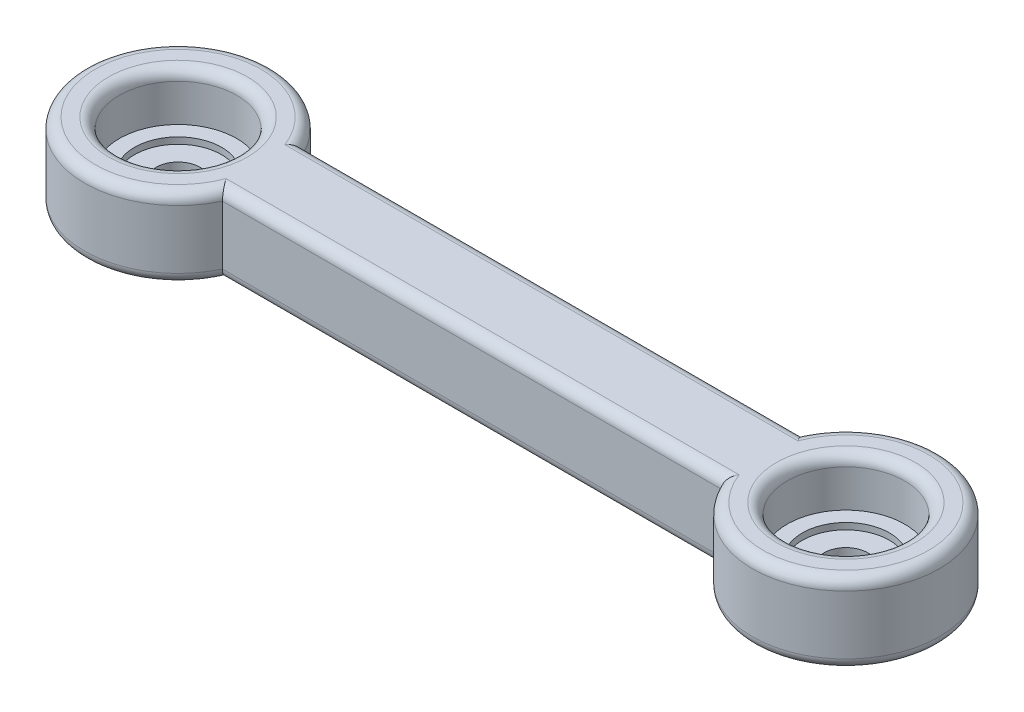
ISO-10303-21;
HEADER;
FILE_DESCRIPTION(('STEP AP214'),'2;1');
FILE_NAME('part.step','',(''),(''),'','','');
FILE_SCHEMA(('AUTOMOTIVE_DESIGN { 1 0 10303 214 1 1 1 1 }'));
ENDSEC;
DATA;
#1=APPLICATION_CONTEXT('core data for automotive mechanical design processes');
#2=APPLICATION_PROTOCOL_DEFINITION('international standard','automotive_design',2000,#1);
#3=PRODUCT_CONTEXT('',#1,'mechanical');
#4=PRODUCT('Part','Part','',(#3));
#5=PRODUCT_RELATED_PRODUCT_CATEGORY('part','',(#4));
#6=PRODUCT_DEFINITION_FORMATION('','',#4);
#7=PRODUCT_DEFINITION_CONTEXT('part definition',#1,'design');
#8=PRODUCT_DEFINITION('design','',#6,#7);
#9=PRODUCT_DEFINITION_SHAPE('','',#8);
#10=(LENGTH_UNIT() NAMED_UNIT(*) SI_UNIT(.MILLI.,.METRE.));
#11=(NAMED_UNIT(*) PLANE_ANGLE_UNIT() SI_UNIT($,.RADIAN.));
#12=(NAMED_UNIT(*) SI_UNIT($,.STERADIAN.) SOLID_ANGLE_UNIT());
#13=UNCERTAINTY_MEASURE_WITH_UNIT(LENGTH_MEASURE(1.E-05),#10,'distance_accuracy_value','');
#14=(GEOMETRIC_REPRESENTATION_CONTEXT(3) GLOBAL_UNCERTAINTY_ASSIGNED_CONTEXT((#13)) GLOBAL_UNIT_ASSIGNED_CONTEXT((#10,
#11,#12)) REPRESENTATION_CONTEXT('',''));
#15=CARTESIAN_POINT('',(0.,0.,0.));
#16=DIRECTION('',(0.,0.,1.));
#17=DIRECTION('',(1.,0.,0.));
#18=AXIS2_PLACEMENT_3D('',#15,#16,#17);
#19=CARTESIAN_POINT('',(62.4999999999998,15.,0.));
#20=DIRECTION('',(0.,1.,0.));
#21=DIRECTION('',(0.,0.,1.));
#22=AXIS2_PLACEMENT_3D('',#19,#20,#21);
#23=PLANE('',#22);
#24=CARTESIAN_POINT('',(62.4999999999998,15.,0.));
#25=DIRECTION('',(0.,1.,0.));
#26=DIRECTION('',(0.,0.,1.));
#27=AXIS2_PLACEMENT_3D('',#24,#25,#26);
#28=CIRCLE('',#27,13.);
#29=CARTESIAN_POINT('',(62.4999999999998,15.,13.));
#30=VERTEX_POINT('',#29);
#31=EDGE_CURVE('E54',#30,#30,#28,.F.);
#32=ORIENTED_EDGE('',*,*,#31,.T.);
#33=EDGE_LOOP('',(#32));
#34=FACE_BOUND('',#33,.T.);
#35=CARTESIAN_POINT('',(-62.5000000000002,15.,0.));
#36=DIRECTION('',(0.,1.,0.));
#37=DIRECTION('',(0.,0.,1.));
#38=AXIS2_PLACEMENT_3D('',#35,#36,#37);
#39=CIRCLE('',#38,15.5);
#40=CARTESIAN_POINT('',(-48.0086232538107,15.,-5.49999999999998));
#41=VERTEX_POINT('',#40);
#42=CARTESIAN_POINT('',(-48.0086232538107,15.,5.50000000000002));
#43=VERTEX_POINT('',#42);
#44=EDGE_CURVE('E64',#41,#43,#39,.T.);
#45=ORIENTED_EDGE('',*,*,#44,.T.);
#46=DIRECTION('',(1.,0.,0.));
#47=VECTOR('',#46,1.);
#48=CARTESIAN_POINT('',(46.6886116991579,15.,5.50000000000001));
#49=LINE('',#48,#47);
#50=CARTESIAN_POINT('',(48.0086232538104,15.,5.50000000000001));
#51=VERTEX_POINT('',#50);
#52=EDGE_CURVE('E378',#43,#51,#49,.T.);
#53=ORIENTED_EDGE('',*,*,#52,.T.);
#54=CARTESIAN_POINT('',(62.4999999999998,15.,0.));
#55=DIRECTION('',(0.,1.,0.));
#56=DIRECTION('',(0.,0.,1.));
#57=AXIS2_PLACEMENT_3D('',#54,#55,#56);
#58=CIRCLE('',#57,15.5);
#59=CARTESIAN_POINT('',(48.0086232538104,15.,-5.50000000000001));
#60=VERTEX_POINT('',#59);
#61=EDGE_CURVE('E373',#51,#60,#58,.T.);
#62=ORIENTED_EDGE('',*,*,#61,.T.);
#63=DIRECTION('',(-1.,0.,0.));
#64=VECTOR('',#63,1.);
#65=CARTESIAN_POINT('',(-46.6886116991583,15.,-5.49999999999998));
#66=LINE('',#65,#64);
#67=EDGE_CURVE('E70',#60,#41,#66,.T.);
#68=ORIENTED_EDGE('',*,*,#67,.T.);
#69=EDGE_LOOP('',(#45,#53,#62,#68));
#70=FACE_BOUND('',#69,.T.);
#71=CARTESIAN_POINT('',(-62.5000000000002,15.,0.));
#72=DIRECTION('',(0.,1.,0.));
#73=DIRECTION('',(0.,0.,1.));
#74=AXIS2_PLACEMENT_3D('',#71,#72,#73);
#75=CIRCLE('',#74,13.);
#76=CARTESIAN_POINT('',(-62.5000000000002,15.,13.));
#77=VERTEX_POINT('',#76);
#78=EDGE_CURVE('E369',#77,#77,#75,.F.);
#79=ORIENTED_EDGE('',*,*,#78,.T.);
#80=EDGE_LOOP('',(#79));
#81=FACE_BOUND('',#80,.T.);
#82=ADVANCED_FACE('F40',(#34,#70,#81),#23,.T.);
#83=CARTESIAN_POINT('',(62.4999999999998,0.,0.));
#84=DIRECTION('',(0.,1.,0.));
#85=DIRECTION('',(0.,0.,1.));
#86=AXIS2_PLACEMENT_3D('',#83,#84,#85);
#87=PLANE('',#86);
#88=CARTESIAN_POINT('',(-62.5000000000002,0.,0.));
#89=DIRECTION('',(0.,1.,0.));
#90=DIRECTION('',(0.,0.,1.));
#91=AXIS2_PLACEMENT_3D('',#88,#89,#90);
#92=CIRCLE('',#91,4.1);
#93=CARTESIAN_POINT('',(-62.5000000000002,0.,4.10000000000002));
#94=VERTEX_POINT('',#93);
#95=EDGE_CURVE('E192',#94,#94,#92,.F.);
#96=ORIENTED_EDGE('',*,*,#95,.F.);
#97=EDGE_LOOP('',(#96));
#98=FACE_BOUND('',#97,.T.);
#99=CARTESIAN_POINT('',(62.4999999999998,0.,0.));
#100=DIRECTION('',(0.,1.,0.));
#101=DIRECTION('',(0.,0.,1.));
#102=AXIS2_PLACEMENT_3D('',#99,#100,#101);
#103=CIRCLE('',#102,4.09999999999999);
#104=CARTESIAN_POINT('',(62.4999999999998,0.,4.09999999999999));
#105=VERTEX_POINT('',#104);
#106=EDGE_CURVE('E296',#105,#105,#103,.F.);
#107=ORIENTED_EDGE('',*,*,#106,.F.);
#108=EDGE_LOOP('',(#107));
#109=FACE_BOUND('',#108,.T.);
#110=CARTESIAN_POINT('',(-62.5000000000002,0.,0.));
#111=DIRECTION('',(0.,1.,0.));
#112=DIRECTION('',(0.,0.,1.));
#113=AXIS2_PLACEMENT_3D('',#110,#111,#112);
#114=CIRCLE('',#113,15.5);
#115=CARTESIAN_POINT('',(-48.0086232538107,0.,5.50000000000002));
#116=VERTEX_POINT('',#115);
#117=CARTESIAN_POINT('',(-48.0086232538107,0.,-5.49999999999998));
#118=VERTEX_POINT('',#117);
#119=EDGE_CURVE('E345',#116,#118,#114,.F.);
#120=ORIENTED_EDGE('',*,*,#119,.T.);
#121=DIRECTION('',(-1.,0.,0.));
#122=VECTOR('',#121,1.);
#123=CARTESIAN_POINT('',(62.4999999999998,0.,-5.50000000000001));
#124=LINE('',#123,#122);
#125=CARTESIAN_POINT('',(48.0086232538104,0.,-5.50000000000001));
#126=VERTEX_POINT('',#125);
#127=EDGE_CURVE('E132',#118,#126,#124,.F.);
#128=ORIENTED_EDGE('',*,*,#127,.T.);
#129=CARTESIAN_POINT('',(62.4999999999998,0.,0.));
#130=DIRECTION('',(0.,1.,0.));
#131=DIRECTION('',(0.,0.,1.));
#132=AXIS2_PLACEMENT_3D('',#129,#130,#131);
#133=CIRCLE('',#132,15.5);
#134=CARTESIAN_POINT('',(48.0086232538104,0.,5.50000000000001));
#135=VERTEX_POINT('',#134);
#136=EDGE_CURVE('E339',#126,#135,#133,.F.);
#137=ORIENTED_EDGE('',*,*,#136,.T.);
#138=DIRECTION('',(1.,0.,0.));
#139=VECTOR('',#138,1.);
#140=CARTESIAN_POINT('',(62.4999999999998,0.,5.50000000000001));
#141=LINE('',#140,#139);
#142=EDGE_CURVE('E342',#135,#116,#141,.F.);
#143=ORIENTED_EDGE('',*,*,#142,.T.);
#144=EDGE_LOOP('',(#120,#128,#137,#143));
#145=FACE_BOUND('',#144,.T.);
#146=ADVANCED_FACE('F232',(#98,#109,#145),#87,.F.);
#147=CARTESIAN_POINT('',(62.4999999999998,15.,0.));
#148=DIRECTION('',(0.,-1.,0.));
#149=DIRECTION('',(0.,0.,-1.));
#150=AXIS2_PLACEMENT_3D('',#147,#148,#149);
#151=CYLINDRICAL_SURFACE('',#150,17.5);
#152=DIRECTION('',(0.,-1.,0.));
#153=VECTOR('',#152,1.);
#154=CARTESIAN_POINT('',(46.6886116991579,15.,7.50000000000001));
#155=LINE('',#154,#153);
#156=CARTESIAN_POINT('',(46.6886116991579,13.,7.50000000000001));
#157=VERTEX_POINT('',#156);
#158=CARTESIAN_POINT('',(46.6886116991579,2.,7.50000000000001));
#159=VERTEX_POINT('',#158);
#160=EDGE_CURVE('E313',#157,#159,#155,.T.);
#161=ORIENTED_EDGE('',*,*,#160,.T.);
#162=CARTESIAN_POINT('',(62.4999999999998,2.,0.));
#163=DIRECTION('',(0.,1.,0.));
#164=DIRECTION('',(0.,0.,1.));
#165=AXIS2_PLACEMENT_3D('',#162,#163,#164);
#166=CIRCLE('',#165,17.5);
#167=CARTESIAN_POINT('',(46.6886116991579,2.,-7.50000000000001));
#168=VERTEX_POINT('',#167);
#169=EDGE_CURVE('E362',#159,#168,#166,.T.);
#170=ORIENTED_EDGE('',*,*,#169,.T.);
#171=DIRECTION('',(0.,-1.,0.));
#172=VECTOR('',#171,1.);
#173=CARTESIAN_POINT('',(46.6886116991579,15.,-7.50000000000001));
#174=LINE('',#173,#172);
#175=CARTESIAN_POINT('',(46.6886116991579,13.,-7.50000000000001));
#176=VERTEX_POINT('',#175);
#177=EDGE_CURVE('E144',#176,#168,#174,.T.);
#178=ORIENTED_EDGE('',*,*,#177,.F.);
#179=CARTESIAN_POINT('',(62.4999999999998,13.,0.));
#180=DIRECTION('',(0.,1.,0.));
#181=DIRECTION('',(0.,0.,1.));
#182=AXIS2_PLACEMENT_3D('',#179,#180,#181);
#183=CIRCLE('',#182,17.5);
#184=EDGE_CURVE('E359',#176,#157,#183,.F.);
#185=ORIENTED_EDGE('',*,*,#184,.T.);
#186=EDGE_LOOP('',(#161,#170,#178,#185));
#187=FACE_BOUND('',#186,.T.);
#188=ADVANCED_FACE('F228',(#187),#151,.T.);
#189=CARTESIAN_POINT('',(-46.6886116991583,15.,-7.49999999999998));
#190=DIRECTION('',(0.,0.,1.));
#191=DIRECTION('',(1.,0.,0.));
#192=AXIS2_PLACEMENT_3D('',#189,#190,#191);
#193=PLANE('',#192);
#194=ORIENTED_EDGE('',*,*,#177,.T.);
#195=DIRECTION('',(-1.,0.,0.));
#196=VECTOR('',#195,1.);
#197=CARTESIAN_POINT('',(-46.6886116991583,2.,-7.49999999999998));
#198=LINE('',#197,#196);
#199=CARTESIAN_POINT('',(-46.6886116991583,2.,-7.49999999999998));
#200=VERTEX_POINT('',#199);
#201=EDGE_CURVE('E142',#168,#200,#198,.T.);
#202=ORIENTED_EDGE('',*,*,#201,.T.);
#203=DIRECTION('',(0.,-1.,0.));
#204=VECTOR('',#203,1.);
#205=CARTESIAN_POINT('',(-46.6886116991583,15.,-7.49999999999998));
#206=LINE('',#205,#204);
#207=CARTESIAN_POINT('',(-46.6886116991583,13.,-7.49999999999998));
#208=VERTEX_POINT('',#207);
#209=EDGE_CURVE('E124',#208,#200,#206,.T.);
#210=ORIENTED_EDGE('',*,*,#209,.F.);
#211=DIRECTION('',(-1.,0.,0.));
#212=VECTOR('',#211,1.);
#213=CARTESIAN_POINT('',(46.6886116991579,13.,-7.50000000000001));
#214=LINE('',#213,#212);
#215=EDGE_CURVE('E139',#208,#176,#214,.F.);
#216=ORIENTED_EDGE('',*,*,#215,.T.);
#217=EDGE_LOOP('',(#194,#202,#210,#216));
#218=FACE_BOUND('',#217,.T.);
#219=ADVANCED_FACE('F138',(#218),#193,.F.);
#220=CARTESIAN_POINT('',(-62.5000000000002,15.,0.));
#221=DIRECTION('',(0.,-1.,0.));
#222=DIRECTION('',(0.,0.,-1.));
#223=AXIS2_PLACEMENT_3D('',#220,#221,#222);
#224=CYLINDRICAL_SURFACE('',#223,17.5);
#225=ORIENTED_EDGE('',*,*,#209,.T.);
#226=CARTESIAN_POINT('',(-62.5000000000002,2.,0.));
#227=DIRECTION('',(0.,1.,0.));
#228=DIRECTION('',(0.,0.,1.));
#229=AXIS2_PLACEMENT_3D('',#226,#227,#228);
#230=CIRCLE('',#229,17.5);
#231=CARTESIAN_POINT('',(-46.6886116991583,2.,7.50000000000001));
#232=VERTEX_POINT('',#231);
#233=EDGE_CURVE('E131',#200,#232,#230,.T.);
#234=ORIENTED_EDGE('',*,*,#233,.T.);
#235=DIRECTION('',(0.,-1.,0.));
#236=VECTOR('',#235,1.);
#237=CARTESIAN_POINT('',(-46.6886116991583,15.,7.50000000000001));
#238=LINE('',#237,#236);
#239=CARTESIAN_POINT('',(-46.6886116991583,13.,7.50000000000001));
#240=VERTEX_POINT('',#239);
#241=EDGE_CURVE('E126',#240,#232,#238,.T.);
#242=ORIENTED_EDGE('',*,*,#241,.F.);
#243=CARTESIAN_POINT('',(-62.5000000000002,13.,0.));
#244=DIRECTION('',(0.,1.,0.));
#245=DIRECTION('',(0.,0.,1.));
#246=AXIS2_PLACEMENT_3D('',#243,#244,#245);
#247=CIRCLE('',#246,17.5);
#248=EDGE_CURVE('E121',#240,#208,#247,.F.);
#249=ORIENTED_EDGE('',*,*,#248,.T.);
#250=EDGE_LOOP('',(#225,#234,#242,#249));
#251=FACE_BOUND('',#250,.T.);
#252=ADVANCED_FACE('F123',(#251),#224,.T.);
#253=CARTESIAN_POINT('',(-46.6886116991583,15.,7.50000000000002));
#254=DIRECTION('',(0.,0.,-1.));
#255=DIRECTION('',(-1.,0.,0.));
#256=AXIS2_PLACEMENT_3D('',#253,#254,#255);
#257=PLANE('',#256);
#258=ORIENTED_EDGE('',*,*,#241,.T.);
#259=DIRECTION('',(1.,0.,0.));
#260=VECTOR('',#259,1.);
#261=CARTESIAN_POINT('',(-46.6886116991583,2.,7.50000000000002));
#262=LINE('',#261,#260);
#263=EDGE_CURVE('E356',#232,#159,#262,.T.);
#264=ORIENTED_EDGE('',*,*,#263,.T.);
#265=ORIENTED_EDGE('',*,*,#160,.F.);
#266=DIRECTION('',(1.,0.,0.));
#267=VECTOR('',#266,1.);
#268=CARTESIAN_POINT('',(-46.6886116991583,13.,7.50000000000002));
#269=LINE('',#268,#267);
#270=EDGE_CURVE('E353',#157,#240,#269,.F.);
#271=ORIENTED_EDGE('',*,*,#270,.T.);
#272=EDGE_LOOP('',(#258,#264,#265,#271));
#273=FACE_BOUND('',#272,.T.);
#274=ADVANCED_FACE('F238',(#273),#257,.F.);
#275=CARTESIAN_POINT('',(-62.5000000000002,15.,0.));
#276=DIRECTION('',(0.,-1.,0.));
#277=DIRECTION('',(0.,0.,-1.));
#278=AXIS2_PLACEMENT_3D('',#275,#276,#277);
#279=CYLINDRICAL_SURFACE('',#278,11.);
#280=CARTESIAN_POINT('',(-62.5000000000002,13.,0.));
#281=DIRECTION('',(0.,1.,0.));
#282=DIRECTION('',(0.,0.,1.));
#283=AXIS2_PLACEMENT_3D('',#280,#281,#282);
#284=CIRCLE('',#283,11.);
#285=CARTESIAN_POINT('',(-62.5000000000002,13.,11.));
#286=VERTEX_POINT('',#285);
#287=EDGE_CURVE('E11',#286,#286,#284,.T.);
#288=ORIENTED_EDGE('',*,*,#287,.T.);
#289=EDGE_LOOP('',(#288));
#290=FACE_BOUND('',#289,.T.);
#291=CARTESIAN_POINT('',(-62.5000000000002,6.,0.));
#292=DIRECTION('',(0.,1.,0.));
#293=DIRECTION('',(0.,0.,1.));
#294=AXIS2_PLACEMENT_3D('',#291,#292,#293);
#295=CIRCLE('',#294,11.);
#296=CARTESIAN_POINT('',(-62.5000000000002,6.,11.));
#297=VERTEX_POINT('',#296);
#298=EDGE_CURVE('E153',#297,#297,#295,.T.);
#299=ORIENTED_EDGE('',*,*,#298,.F.);
#300=EDGE_LOOP('',(#299));
#301=FACE_BOUND('',#300,.T.);
#302=ADVANCED_FACE('F241',(#290,#301),#279,.F.);
#303=CARTESIAN_POINT('',(62.4999999999998,15.,0.));
#304=DIRECTION('',(0.,-1.,0.));
#305=DIRECTION('',(0.,0.,-1.));
#306=AXIS2_PLACEMENT_3D('',#303,#304,#305);
#307=CYLINDRICAL_SURFACE('',#306,11.);
#308=CARTESIAN_POINT('',(62.4999999999998,13.,0.));
#309=DIRECTION('',(0.,1.,0.));
#310=DIRECTION('',(0.,0.,1.));
#311=AXIS2_PLACEMENT_3D('',#308,#309,#310);
#312=CIRCLE('',#311,11.);
#313=CARTESIAN_POINT('',(62.4999999999998,13.,11.));
#314=VERTEX_POINT('',#313);
#315=EDGE_CURVE('E365',#314,#314,#312,.T.);
#316=ORIENTED_EDGE('',*,*,#315,.T.);
#317=EDGE_LOOP('',(#316));
#318=FACE_BOUND('',#317,.T.);
#319=CARTESIAN_POINT('',(62.4999999999998,6.,0.));
#320=DIRECTION('',(0.,1.,0.));
#321=DIRECTION('',(0.,0.,1.));
#322=AXIS2_PLACEMENT_3D('',#319,#320,#321);
#323=CIRCLE('',#322,11.);
#324=CARTESIAN_POINT('',(62.4999999999998,6.,11.));
#325=VERTEX_POINT('',#324);
#326=EDGE_CURVE('E330',#325,#325,#323,.T.);
#327=ORIENTED_EDGE('',*,*,#326,.F.);
#328=EDGE_LOOP('',(#327));
#329=FACE_BOUND('',#328,.T.);
#330=ADVANCED_FACE('F251',(#318,#329),#307,.F.);
#331=CARTESIAN_POINT('',(62.4999999999998,6.,0.));
#332=DIRECTION('',(0.,1.,0.));
#333=DIRECTION('',(0.,0.,1.));
#334=AXIS2_PLACEMENT_3D('',#331,#332,#333);
#335=PLANE('',#334);
#336=CARTESIAN_POINT('',(62.4999999999998,6.,0.));
#337=DIRECTION('',(0.,1.,0.));
#338=DIRECTION('',(0.,0.,1.));
#339=AXIS2_PLACEMENT_3D('',#336,#337,#338);
#340=CIRCLE('',#339,8.16000000000001);
#341=CARTESIAN_POINT('',(62.4999999999998,6.,8.16));
#342=VERTEX_POINT('',#341);
#343=EDGE_CURVE('E200',#342,#342,#340,.T.);
#344=ORIENTED_EDGE('',*,*,#343,.F.);
#345=EDGE_LOOP('',(#344));
#346=FACE_BOUND('',#345,.T.);
#347=ORIENTED_EDGE('',*,*,#326,.T.);
#348=EDGE_LOOP('',(#347));
#349=FACE_BOUND('',#348,.T.);
#350=ADVANCED_FACE('F255',(#346,#349),#335,.T.);
#351=CARTESIAN_POINT('',(-62.5000000000002,6.,0.));
#352=DIRECTION('',(0.,1.,0.));
#353=DIRECTION('',(0.,0.,1.));
#354=AXIS2_PLACEMENT_3D('',#351,#352,#353);
#355=PLANE('',#354);
#356=CARTESIAN_POINT('',(-62.5000000000002,6.,0.));
#357=DIRECTION('',(0.,1.,0.));
#358=DIRECTION('',(0.,0.,1.));
#359=AXIS2_PLACEMENT_3D('',#356,#357,#358);
#360=CIRCLE('',#359,8.16);
#361=CARTESIAN_POINT('',(-62.5000000000002,6.,8.16000000000002));
#362=VERTEX_POINT('',#361);
#363=EDGE_CURVE('E314',#362,#362,#360,.T.);
#364=ORIENTED_EDGE('',*,*,#363,.F.);
#365=EDGE_LOOP('',(#364));
#366=FACE_BOUND('',#365,.T.);
#367=ORIENTED_EDGE('',*,*,#298,.T.);
#368=EDGE_LOOP('',(#367));
#369=FACE_BOUND('',#368,.T.);
#370=ADVANCED_FACE('F259',(#366,#369),#355,.T.);
#371=CARTESIAN_POINT('',(-62.5000000000002,4.8,0.));
#372=DIRECTION('',(0.,1.,0.));
#373=DIRECTION('',(0.,0.,1.));
#374=AXIS2_PLACEMENT_3D('',#371,#372,#373);
#375=CYLINDRICAL_SURFACE('',#374,8.16);
#376=CARTESIAN_POINT('',(-62.5000000000002,4.8,0.));
#377=DIRECTION('',(0.,1.,0.));
#378=DIRECTION('',(0.,0.,1.));
#379=AXIS2_PLACEMENT_3D('',#376,#377,#378);
#380=CIRCLE('',#379,8.16);
#381=CARTESIAN_POINT('',(-62.5000000000002,4.8,8.16000000000002));
#382=VERTEX_POINT('',#381);
#383=EDGE_CURVE('E310',#382,#382,#380,.T.);
#384=ORIENTED_EDGE('',*,*,#383,.F.);
#385=EDGE_LOOP('',(#384));
#386=FACE_BOUND('',#385,.T.);
#387=ORIENTED_EDGE('',*,*,#363,.T.);
#388=EDGE_LOOP('',(#387));
#389=FACE_BOUND('',#388,.T.);
#390=ADVANCED_FACE('F263',(#386,#389),#375,.F.);
#391=CARTESIAN_POINT('',(-62.5000000000002,4.8,0.));
#392=DIRECTION('',(0.,1.,0.));
#393=DIRECTION('',(0.,0.,1.));
#394=AXIS2_PLACEMENT_3D('',#391,#392,#393);
#395=PLANE('',#394);
#396=CARTESIAN_POINT('',(-62.5000000000002,4.8,0.));
#397=DIRECTION('',(0.,1.,0.));
#398=DIRECTION('',(0.,0.,1.));
#399=AXIS2_PLACEMENT_3D('',#396,#397,#398);
#400=CIRCLE('',#399,4.1);
#401=CARTESIAN_POINT('',(-62.5000000000002,4.8,4.10000000000002));
#402=VERTEX_POINT('',#401);
#403=EDGE_CURVE('E294',#402,#402,#400,.T.);
#404=ORIENTED_EDGE('',*,*,#403,.F.);
#405=EDGE_LOOP('',(#404));
#406=FACE_BOUND('',#405,.T.);
#407=ORIENTED_EDGE('',*,*,#383,.T.);
#408=EDGE_LOOP('',(#407));
#409=FACE_BOUND('',#408,.T.);
#410=ADVANCED_FACE('F269',(#406,#409),#395,.T.);
#411=CARTESIAN_POINT('',(62.4999999999998,4.8,0.));
#412=DIRECTION('',(0.,1.,0.));
#413=DIRECTION('',(0.,0.,1.));
#414=AXIS2_PLACEMENT_3D('',#411,#412,#413);
#415=CYLINDRICAL_SURFACE('',#414,8.16000000000001);
#416=CARTESIAN_POINT('',(62.4999999999998,4.8,0.));
#417=DIRECTION('',(0.,1.,0.));
#418=DIRECTION('',(0.,0.,1.));
#419=AXIS2_PLACEMENT_3D('',#416,#417,#418);
#420=CIRCLE('',#419,8.16000000000001);
#421=CARTESIAN_POINT('',(62.4999999999998,4.8,8.16));
#422=VERTEX_POINT('',#421);
#423=EDGE_CURVE('E318',#422,#422,#420,.T.);
#424=ORIENTED_EDGE('',*,*,#423,.F.);
#425=EDGE_LOOP('',(#424));
#426=FACE_BOUND('',#425,.T.);
#427=ORIENTED_EDGE('',*,*,#343,.T.);
#428=EDGE_LOOP('',(#427));
#429=FACE_BOUND('',#428,.T.);
#430=ADVANCED_FACE('F265',(#426,#429),#415,.F.);
#431=CARTESIAN_POINT('',(62.4999999999998,4.8,0.));
#432=DIRECTION('',(0.,1.,0.));
#433=DIRECTION('',(0.,0.,1.));
#434=AXIS2_PLACEMENT_3D('',#431,#432,#433);
#435=PLANE('',#434);
#436=CARTESIAN_POINT('',(62.4999999999998,4.8,0.));
#437=DIRECTION('',(0.,1.,0.));
#438=DIRECTION('',(0.,0.,1.));
#439=AXIS2_PLACEMENT_3D('',#436,#437,#438);
#440=CIRCLE('',#439,4.09999999999999);
#441=CARTESIAN_POINT('',(62.4999999999998,4.8,4.09999999999999));
#442=VERTEX_POINT('',#441);
#443=EDGE_CURVE('E304',#442,#442,#440,.T.);
#444=ORIENTED_EDGE('',*,*,#443,.F.);
#445=EDGE_LOOP('',(#444));
#446=FACE_BOUND('',#445,.T.);
#447=ORIENTED_EDGE('',*,*,#423,.T.);
#448=EDGE_LOOP('',(#447));
#449=FACE_BOUND('',#448,.T.);
#450=ADVANCED_FACE('F268',(#446,#449),#435,.T.);
#451=CARTESIAN_POINT('',(-46.6886116991583,2.,5.50000000000002));
#452=DIRECTION('',(1.,0.,0.));
#453=DIRECTION('',(0.,0.,-1.));
#454=AXIS2_PLACEMENT_3D('',#451,#452,#453);
#455=CYLINDRICAL_SURFACE('',#454,2.);
#456=CARTESIAN_POINT('',(-46.6886116991583,2.,7.50000000000002));
#457=CARTESIAN_POINT('',(-46.6886065551109,1.9500604911839,7.50000900211605));
#458=CARTESIAN_POINT('',(-46.6897945450617,1.90012615232308,7.4981297773659));
#459=CARTESIAN_POINT('',(-46.6945172382145,1.80066465759595,7.49066375799005));
#460=CARTESIAN_POINT('',(-46.698051094621,1.7511373613267,7.48507830121624));
#461=CARTESIAN_POINT('',(-46.7074045248444,1.65307555334308,7.47030256383436));
#462=CARTESIAN_POINT('',(-46.7132135436088,1.60453753071152,7.46112892994321));
#463=CARTESIAN_POINT('',(-46.727039308637,1.50858028985842,7.4393120707872));
#464=CARTESIAN_POINT('',(-46.73505616242,1.46116112624619,7.42666867654899));
#465=CARTESIAN_POINT('',(-46.7622678059415,1.32116908508248,7.38379411558223));
#466=CARTESIAN_POINT('',(-46.784642323748,1.23067035412305,7.34858900579417));
#467=CARTESIAN_POINT('',(-46.836910931278,1.05745225277378,7.26658399757591));
#468=CARTESIAN_POINT('',(-46.8668119989202,0.974740199785717,7.21977334016848));
#469=CARTESIAN_POINT('',(-46.9348917661753,0.814183927164822,7.11356878347687));
#470=CARTESIAN_POINT('',(-46.9734370068153,0.736862483254431,7.05362184221194));
#471=CARTESIAN_POINT('',(-47.0564349781274,0.59345161599352,6.92509888936939));
#472=CARTESIAN_POINT('',(-47.1008889093873,0.52736448157957,6.8565211242445));
#473=CARTESIAN_POINT('',(-47.2013960010556,0.398057930441567,6.70222054663587));
#474=CARTESIAN_POINT('',(-47.2581952053353,0.336663718550164,6.6154560762574));
#475=CARTESIAN_POINT('',(-47.3765561024594,0.229308769230114,6.43575212668639));
#476=CARTESIAN_POINT('',(-47.4381239937186,0.183368547805886,6.34280463361379));
#477=CARTESIAN_POINT('',(-47.5812283672707,0.0968260109423766,6.12816949913107));
#478=CARTESIAN_POINT('',(-47.6637758642884,0.0607625439881221,6.00532327634425));
#479=CARTESIAN_POINT('',(-47.8318768212537,0.012617330608573,5.75733948482863));
#480=CARTESIAN_POINT('',(-47.9174241129171,0.000489008760443391,5.63220684532827));
#481=CARTESIAN_POINT('',(-48.0051209751544,4.82626402260844E-06,5.50507573977418));
#482=CARTESIAN_POINT('',(-48.0068720367421,-4.02469082086319E-09,5.50253775026879));
#483=CARTESIAN_POINT('',(-48.0086232538107,0.,5.50000000000001));
#484=B_SPLINE_CURVE_WITH_KNOTS('',3,(#456,#457,#458,#459,#460,#461,#462,#463,#464,#465,#466,
#467,#468,#469,#470,#471,#472,#473,#474,#475,#476,#477,#478,#479,#480,#481,#482,#483),
.UNSPECIFIED.,.F.,.F.,(4,2,2,2,2,2,2,2,2,2,2,2,2,4),(0.,0.149760434254278,0.299466838333403,
0.448486790194276,0.597514000444192,0.894992489976454,1.19274779635172,1.50698264104526,
1.82128143304112,2.18143671032964,2.54206824345127,2.9970232244066,3.45109203165253,
3.46034234732407),.UNSPECIFIED.);
#485=EDGE_CURVE('E201',#116,#232,#484,.F.);
#486=ORIENTED_EDGE('',*,*,#485,.F.);
#487=ORIENTED_EDGE('',*,*,#142,.F.);
#488=CARTESIAN_POINT('',(46.6886116991579,2.,7.50000000000001));
#489=CARTESIAN_POINT('',(46.6886065551106,1.9500604911839,7.50000900211605));
#490=CARTESIAN_POINT('',(46.6897945450614,1.90012615232308,7.4981297773659));
#491=CARTESIAN_POINT('',(46.6945172382142,1.80066465759595,7.49066375799004));
#492=CARTESIAN_POINT('',(46.6980510946206,1.7511373613267,7.48507830121624));
#493=CARTESIAN_POINT('',(46.707404524844,1.65307555334307,7.47030256383435));
#494=CARTESIAN_POINT('',(46.7132135436084,1.60453753071152,7.4611289299432));
#495=CARTESIAN_POINT('',(46.7270393086367,1.50858028985842,7.43931207078719));
#496=CARTESIAN_POINT('',(46.7350561624197,1.46116112624619,7.42666867654898));
#497=CARTESIAN_POINT('',(46.7622678059412,1.32116908508248,7.38379411558222));
#498=CARTESIAN_POINT('',(46.7846423237477,1.23067035412305,7.34858900579417));
#499=CARTESIAN_POINT('',(46.8369109312777,1.05745225277378,7.26658399757591));
#500=CARTESIAN_POINT('',(46.8668119989199,0.974740199785717,7.21977334016847));
#501=CARTESIAN_POINT('',(46.934891766175,0.814183927164822,7.11356878347686));
#502=CARTESIAN_POINT('',(46.9734370068149,0.73686248325443,7.05362184221193));
#503=CARTESIAN_POINT('',(47.0564349781271,0.593451615993518,6.92509888936939));
#504=CARTESIAN_POINT('',(47.1008889093869,0.527364481579569,6.85652112424449));
#505=CARTESIAN_POINT('',(47.2013960010553,0.398057930441565,6.70222054663586));
#506=CARTESIAN_POINT('',(47.258195205335,0.33666371855016,6.61545607625739));
#507=CARTESIAN_POINT('',(47.3765561024591,0.229308769230109,6.43575212668637));
#508=CARTESIAN_POINT('',(47.4381239937182,0.183368547805882,6.34280463361378));
#509=CARTESIAN_POINT('',(47.5812283672704,0.0968260109423757,6.12816949913107));
#510=CARTESIAN_POINT('',(47.663775864288,0.0607625439881216,6.00532327634426));
#511=CARTESIAN_POINT('',(47.8318768212533,0.0126173306085741,5.75733948482862));
#512=CARTESIAN_POINT('',(47.9174241129167,0.00048900876044615,5.63220684532823));
#513=CARTESIAN_POINT('',(48.005120975154,4.82626402271377E-06,5.50507573977418));
#514=CARTESIAN_POINT('',(48.0068720367418,-4.02469077015663E-09,5.50253775026879));
#515=CARTESIAN_POINT('',(48.0086232538104,0.,5.50000000000001));
#516=B_SPLINE_CURVE_WITH_KNOTS('',3,(#488,#489,#490,#491,#492,#493,#494,#495,#496,#497,#498,
#499,#500,#501,#502,#503,#504,#505,#506,#507,#508,#509,#510,#511,#512,#513,#514,#515),
.UNSPECIFIED.,.F.,.F.,(4,2,2,2,2,2,2,2,2,2,2,2,2,4),(0.,0.149760434254279,0.299466838333404,
0.448486790194277,0.597514000444192,0.894992489976454,1.19274779635172,1.50698264104525,
1.82128143304112,2.18143671032964,2.54206824345128,2.99702322440659,3.45109203165252,
3.46034234732407),.UNSPECIFIED.);
#517=EDGE_CURVE('E193',#159,#135,#516,.T.);
#518=ORIENTED_EDGE('',*,*,#517,.F.);
#519=ORIENTED_EDGE('',*,*,#263,.F.);
#520=EDGE_LOOP('',(#486,#487,#518,#519));
#521=FACE_BOUND('',#520,.T.);
#522=ADVANCED_FACE('F207',(#521),#455,.T.);
#523=CARTESIAN_POINT('',(62.4999999999998,2.,0.));
#524=DIRECTION('',(0.,1.,0.));
#525=DIRECTION('',(0.,0.,1.));
#526=AXIS2_PLACEMENT_3D('',#523,#524,#525);
#527=TOROIDAL_SURFACE('',#526,15.5,2.);
#528=ORIENTED_EDGE('',*,*,#517,.T.);
#529=ORIENTED_EDGE('',*,*,#136,.F.);
#530=CARTESIAN_POINT('',(46.6886116991579,2.,-7.50000000000001));
#531=CARTESIAN_POINT('',(46.6886065551106,1.9500604911839,-7.50000900211605));
#532=CARTESIAN_POINT('',(46.6897945450614,1.90012615232308,-7.4981297773659));
#533=CARTESIAN_POINT('',(46.6945172382142,1.80066465759595,-7.49066375799004));
#534=CARTESIAN_POINT('',(46.6980510946206,1.75113736132669,-7.48507830121624));
#535=CARTESIAN_POINT('',(46.707404524844,1.65307555334307,-7.47030256383435));
#536=CARTESIAN_POINT('',(46.7132135436084,1.60453753071152,-7.4611289299432));
#537=CARTESIAN_POINT('',(46.7270393086367,1.50858028985842,-7.43931207078719));
#538=CARTESIAN_POINT('',(46.7350561624197,1.46116112624619,-7.42666867654898));
#539=CARTESIAN_POINT('',(46.7622678059412,1.32116908508248,-7.38379411558222));
#540=CARTESIAN_POINT('',(46.7846423237477,1.23067035412305,-7.34858900579417));
#541=CARTESIAN_POINT('',(46.8369109312777,1.05745225277378,-7.2665839975759));
#542=CARTESIAN_POINT('',(46.8668119989199,0.974740199785716,-7.21977334016847));
#543=CARTESIAN_POINT('',(46.934891766175,0.814183927164821,-7.11356878347686));
#544=CARTESIAN_POINT('',(46.9734370068149,0.73686248325443,-7.05362184221193));
#545=CARTESIAN_POINT('',(47.0564349781271,0.593451615993518,-6.92509888936939));
#546=CARTESIAN_POINT('',(47.1008889093869,0.527364481579569,-6.85652112424449));
#547=CARTESIAN_POINT('',(47.2013960010553,0.398057930441566,-6.70222054663587));
#548=CARTESIAN_POINT('',(47.258195205335,0.336663718550162,-6.6154560762574));
#549=CARTESIAN_POINT('',(47.3765561024591,0.229308769230112,-6.43575212668638));
#550=CARTESIAN_POINT('',(47.4381239937182,0.183368547805884,-6.34280463361378));
#551=CARTESIAN_POINT('',(47.5812283672704,0.0968260109423761,-6.12816949913106));
#552=CARTESIAN_POINT('',(47.663775864288,0.0607625439881218,-6.00532327634425));
#553=CARTESIAN_POINT('',(47.8318768212534,0.0126173306085748,-5.75733948482863));
#554=CARTESIAN_POINT('',(47.9174241129168,0.00048900876044754,-5.63220684532828));
#555=CARTESIAN_POINT('',(48.005120975154,4.82626402277385E-06,-5.50507573977418));
#556=CARTESIAN_POINT('',(48.0068720367418,-4.02469073756386E-09,-5.50253775026879));
#557=CARTESIAN_POINT('',(48.0086232538104,0.,-5.50000000000001));
#558=B_SPLINE_CURVE_WITH_KNOTS('',3,(#530,#531,#532,#533,#534,#535,#536,#537,#538,#539,#540,
#541,#542,#543,#544,#545,#546,#547,#548,#549,#550,#551,#552,#553,#554,#555,#556,#557),
.UNSPECIFIED.,.F.,.F.,(4,2,2,2,2,2,2,2,2,2,2,2,2,4),(0.,0.14976043425428,0.299466838333404,
0.448486790194277,0.597514000444193,0.894992489976455,1.19274779635172,1.50698264104526,
1.82128143304112,2.18143671032964,2.54206824345127,2.99702322440659,3.45109203165253,
3.46034234732407),.UNSPECIFIED.);
#559=EDGE_CURVE('E161',#168,#126,#558,.T.);
#560=ORIENTED_EDGE('',*,*,#559,.F.);
#561=ORIENTED_EDGE('',*,*,#169,.F.);
#562=EDGE_LOOP('',(#528,#529,#560,#561));
#563=FACE_BOUND('',#562,.T.);
#564=ADVANCED_FACE('F209',(#563),#527,.T.);
#565=CARTESIAN_POINT('',(-62.5000000000002,2.,0.));
#566=DIRECTION('',(0.,1.,0.));
#567=DIRECTION('',(0.,0.,1.));
#568=AXIS2_PLACEMENT_3D('',#565,#566,#567);
#569=TOROIDAL_SURFACE('',#568,15.5,2.);
#570=ORIENTED_EDGE('',*,*,#485,.T.);
#571=ORIENTED_EDGE('',*,*,#233,.F.);
#572=CARTESIAN_POINT('',(-46.6886116991583,2.,-7.49999999999998));
#573=CARTESIAN_POINT('',(-46.6886065551109,1.9500604911839,-7.50000900211602));
#574=CARTESIAN_POINT('',(-46.6897945450617,1.90012615232308,-7.49812977736587));
#575=CARTESIAN_POINT('',(-46.6945172382145,1.80066465759595,-7.49066375799002));
#576=CARTESIAN_POINT('',(-46.698051094621,1.7511373613267,-7.48507830121621));
#577=CARTESIAN_POINT('',(-46.7074045248444,1.65307555334307,-7.47030256383433));
#578=CARTESIAN_POINT('',(-46.7132135436088,1.60453753071152,-7.46112892994317));
#579=CARTESIAN_POINT('',(-46.727039308637,1.50858028985842,-7.43931207078716));
#580=CARTESIAN_POINT('',(-46.73505616242,1.46116112624619,-7.42666867654896));
#581=CARTESIAN_POINT('',(-46.7622678059415,1.32116908508248,-7.38379411558219));
#582=CARTESIAN_POINT('',(-46.784642323748,1.23067035412305,-7.34858900579414));
#583=CARTESIAN_POINT('',(-46.836910931278,1.05745225277378,-7.26658399757588));
#584=CARTESIAN_POINT('',(-46.8668119989202,0.974740199785717,-7.21977334016845));
#585=CARTESIAN_POINT('',(-46.9348917661754,0.814183927164822,-7.11356878347683));
#586=CARTESIAN_POINT('',(-46.9734370068153,0.73686248325443,-7.05362184221191));
#587=CARTESIAN_POINT('',(-47.0564349781274,0.593451615993518,-6.92509888936936));
#588=CARTESIAN_POINT('',(-47.1008889093873,0.527364481579569,-6.85652112424447));
#589=CARTESIAN_POINT('',(-47.2013960010556,0.398057930441565,-6.70222054663584));
#590=CARTESIAN_POINT('',(-47.2581952053353,0.336663718550161,-6.61545607625737));
#591=CARTESIAN_POINT('',(-47.3765561024594,0.229308769230111,-6.43575212668635));
#592=CARTESIAN_POINT('',(-47.4381239937186,0.183368547805884,-6.34280463361376));
#593=CARTESIAN_POINT('',(-47.5812283672707,0.096826010942376,-6.12816949913103));
#594=CARTESIAN_POINT('',(-47.6637758642884,0.0607625439881216,-6.00532327634422));
#595=CARTESIAN_POINT('',(-47.8318768212537,0.0126173306085747,-5.7573394848286));
#596=CARTESIAN_POINT('',(-47.9174241129171,0.000489008760447537,-5.63220684532825));
#597=CARTESIAN_POINT('',(-48.0051209751544,4.82626402277374E-06,-5.50507573977415));
#598=CARTESIAN_POINT('',(-48.0068720367421,-4.02469073762732E-09,-5.50253775026876));
#599=CARTESIAN_POINT('',(-48.0086232538107,0.,-5.49999999999998));
#600=B_SPLINE_CURVE_WITH_KNOTS('',3,(#572,#573,#574,#575,#576,#577,#578,#579,#580,#581,#582,
#583,#584,#585,#586,#587,#588,#589,#590,#591,#592,#593,#594,#595,#596,#597,#598,#599),
.UNSPECIFIED.,.F.,.F.,(4,2,2,2,2,2,2,2,2,2,2,2,2,4),(0.,0.149760434254279,0.299466838333404,
0.448486790194276,0.597514000444191,0.894992489976453,1.19274779635172,1.50698264104526,
1.82128143304112,2.18143671032965,2.54206824345127,2.99702322440659,3.45109203165253,
3.46034234732407),.UNSPECIFIED.);
#601=EDGE_CURVE('E157',#118,#200,#600,.F.);
#602=ORIENTED_EDGE('',*,*,#601,.F.);
#603=ORIENTED_EDGE('',*,*,#119,.F.);
#604=EDGE_LOOP('',(#570,#571,#602,#603));
#605=FACE_BOUND('',#604,.T.);
#606=ADVANCED_FACE('F212',(#605),#569,.T.);
#607=CARTESIAN_POINT('',(-46.6886116991583,2.,-5.49999999999998));
#608=DIRECTION('',(-1.,0.,0.));
#609=DIRECTION('',(0.,0.,1.));
#610=AXIS2_PLACEMENT_3D('',#607,#608,#609);
#611=CYLINDRICAL_SURFACE('',#610,2.);
#612=ORIENTED_EDGE('',*,*,#559,.T.);
#613=ORIENTED_EDGE('',*,*,#127,.F.);
#614=ORIENTED_EDGE('',*,*,#601,.T.);
#615=ORIENTED_EDGE('',*,*,#201,.F.);
#616=EDGE_LOOP('',(#612,#613,#614,#615));
#617=FACE_BOUND('',#616,.T.);
#618=ADVANCED_FACE('F223',(#617),#611,.T.);
#619=CARTESIAN_POINT('',(62.4999999999998,13.,0.));
#620=DIRECTION('',(0.,1.,0.));
#621=DIRECTION('',(0.,0.,1.));
#622=AXIS2_PLACEMENT_3D('',#619,#620,#621);
#623=TOROIDAL_SURFACE('',#622,13.,2.);
#624=ORIENTED_EDGE('',*,*,#31,.F.);
#625=EDGE_LOOP('',(#624));
#626=FACE_BOUND('',#625,.T.);
#627=ORIENTED_EDGE('',*,*,#315,.F.);
#628=EDGE_LOOP('',(#627));
#629=FACE_BOUND('',#628,.T.);
#630=ADVANCED_FACE('F184',(#626,#629),#623,.T.);
#631=CARTESIAN_POINT('',(62.4999999999998,13.,-5.50000000000001));
#632=DIRECTION('',(1.,0.,0.));
#633=DIRECTION('',(0.,0.,-1.));
#634=AXIS2_PLACEMENT_3D('',#631,#632,#633);
#635=CYLINDRICAL_SURFACE('',#634,2.);
#636=CARTESIAN_POINT('',(46.6886116991579,13.,-7.50000000000001));
#637=CARTESIAN_POINT('',(46.6886065551106,13.0499395088161,-7.50000900211605));
#638=CARTESIAN_POINT('',(46.6897945450614,13.0998738476769,-7.4981297773659));
#639=CARTESIAN_POINT('',(46.6945172382142,13.1993353424041,-7.49066375799004));
#640=CARTESIAN_POINT('',(46.6980510946206,13.2488626386733,-7.48507830121623));
#641=CARTESIAN_POINT('',(46.707404524844,13.3469244466569,-7.47030256383435));
#642=CARTESIAN_POINT('',(46.7132135436084,13.3954624692885,-7.4611289299432));
#643=CARTESIAN_POINT('',(46.7270393086367,13.4914197101416,-7.43931207078719));
#644=CARTESIAN_POINT('',(46.7350561624197,13.5388388737538,-7.42666867654898));
#645=CARTESIAN_POINT('',(46.7622678059412,13.6788309149175,-7.38379411558222));
#646=CARTESIAN_POINT('',(46.7846423237477,13.769329645877,-7.34858900579417));
#647=CARTESIAN_POINT('',(46.8369109312777,13.9425477472262,-7.2665839975759));
#648=CARTESIAN_POINT('',(46.8668119989199,14.0252598002143,-7.21977334016847));
#649=CARTESIAN_POINT('',(46.934891766175,14.1858160728352,-7.11356878347686));
#650=CARTESIAN_POINT('',(46.9734370068149,14.2631375167456,-7.05362184221193));
#651=CARTESIAN_POINT('',(47.0564349781271,14.4065483840065,-6.92509888936938));
#652=CARTESIAN_POINT('',(47.1008889093869,14.4726355184204,-6.85652112424449));
#653=CARTESIAN_POINT('',(47.2013960010553,14.6019420695584,-6.70222054663586));
#654=CARTESIAN_POINT('',(47.258195205335,14.6633362814498,-6.61545607625739));
#655=CARTESIAN_POINT('',(47.3765561024591,14.7706912307699,-6.43575212668638));
#656=CARTESIAN_POINT('',(47.4381239937182,14.8166314521941,-6.34280463361379));
#657=CARTESIAN_POINT('',(47.5812283672703,14.9031739890576,-6.12816949913105));
#658=CARTESIAN_POINT('',(47.663775864288,14.9392374560119,-6.0053232763442));
#659=CARTESIAN_POINT('',(47.8318768212534,14.9873826693914,-5.75733948482867));
#660=CARTESIAN_POINT('',(47.917424112917,14.9995109912395,-5.63220684532843));
#661=CARTESIAN_POINT('',(48.005120975154,14.999995173736,-5.50507573977418));
#662=CARTESIAN_POINT('',(48.0068720367418,15.0000000040247,-5.50253775026879));
#663=CARTESIAN_POINT('',(48.0086232538104,15.,-5.50000000000001));
#664=B_SPLINE_CURVE_WITH_KNOTS('',3,(#636,#637,#638,#639,#640,#641,#642,#643,#644,#645,#646,
#647,#648,#649,#650,#651,#652,#653,#654,#655,#656,#657,#658,#659,#660,#661,#662,#663),
.UNSPECIFIED.,.F.,.F.,(4,2,2,2,2,2,2,2,2,2,2,2,2,4),(0.,0.149760434254281,0.299466838333405,
0.448486790194277,0.597514000444195,0.894992489976459,1.19274779635172,1.50698264104526,
1.82128143304112,2.18143671032964,2.54206824345128,2.99702322440659,3.45109203165253,
3.46034234732407),.UNSPECIFIED.);
#665=EDGE_CURVE('E150',#176,#60,#664,.T.);
#666=ORIENTED_EDGE('',*,*,#665,.F.);
#667=ORIENTED_EDGE('',*,*,#215,.F.);
#668=CARTESIAN_POINT('',(-46.6886116991583,13.,-7.49999999999998));
#669=CARTESIAN_POINT('',(-46.6886065551109,13.0499395088161,-7.50000900211602));
#670=CARTESIAN_POINT('',(-46.6897945450617,13.0998738476769,-7.49812977736587));
#671=CARTESIAN_POINT('',(-46.6945172382145,13.199335342404,-7.49066375799002));
#672=CARTESIAN_POINT('',(-46.698051094621,13.2488626386733,-7.48507830121621));
#673=CARTESIAN_POINT('',(-46.7074045248444,13.3469244466569,-7.47030256383433));
#674=CARTESIAN_POINT('',(-46.7132135436088,13.3954624692885,-7.46112892994317));
#675=CARTESIAN_POINT('',(-46.727039308637,13.4914197101416,-7.43931207078716));
#676=CARTESIAN_POINT('',(-46.73505616242,13.5388388737538,-7.42666867654896));
#677=CARTESIAN_POINT('',(-46.7622678059415,13.6788309149175,-7.38379411558219));
#678=CARTESIAN_POINT('',(-46.784642323748,13.769329645877,-7.34858900579414));
#679=CARTESIAN_POINT('',(-46.836910931278,13.9425477472262,-7.26658399757588));
#680=CARTESIAN_POINT('',(-46.8668119989202,14.0252598002143,-7.21977334016845));
#681=CARTESIAN_POINT('',(-46.9348917661754,14.1858160728352,-7.11356878347683));
#682=CARTESIAN_POINT('',(-46.9734370068153,14.2631375167456,-7.0536218422119));
#683=CARTESIAN_POINT('',(-47.0564349781274,14.4065483840065,-6.92509888936936));
#684=CARTESIAN_POINT('',(-47.1008889093873,14.4726355184204,-6.85652112424446));
#685=CARTESIAN_POINT('',(-47.2013960010556,14.6019420695584,-6.70222054663583));
#686=CARTESIAN_POINT('',(-47.2581952053353,14.6633362814498,-6.61545607625736));
#687=CARTESIAN_POINT('',(-47.3765561024594,14.7706912307699,-6.43575212668635));
#688=CARTESIAN_POINT('',(-47.4381239937186,14.8166314521941,-6.34280463361376));
#689=CARTESIAN_POINT('',(-47.5812283672707,14.9031739890576,-6.12816949913102));
#690=CARTESIAN_POINT('',(-47.6637758642883,14.9392374560119,-6.00532327634417));
#691=CARTESIAN_POINT('',(-47.8318768212538,14.9873826693914,-5.75733948482864));
#692=CARTESIAN_POINT('',(-47.9174241129173,14.9995109912395,-5.6322068453284));
#693=CARTESIAN_POINT('',(-48.0051209751544,14.999995173736,-5.50507573977416));
#694=CARTESIAN_POINT('',(-48.0068720367421,15.0000000040247,-5.50253775026876));
#695=CARTESIAN_POINT('',(-48.0086232538107,15.,-5.49999999999998));
#696=B_SPLINE_CURVE_WITH_KNOTS('',3,(#668,#669,#670,#671,#672,#673,#674,#675,#676,#677,#678,
#679,#680,#681,#682,#683,#684,#685,#686,#687,#688,#689,#690,#691,#692,#693,#694,#695),
.UNSPECIFIED.,.F.,.F.,(4,2,2,2,2,2,2,2,2,2,2,2,2,4),(0.,0.149760434254278,0.299466838333402,
0.448486790194275,0.597514000444192,0.894992489976454,1.19274779635172,1.50698264104526,
1.82128143304112,2.18143671032965,2.54206824345128,2.9970232244066,3.45109203165253,
3.46034234732407),.UNSPECIFIED.);
#697=EDGE_CURVE('E44',#41,#208,#696,.F.);
#698=ORIENTED_EDGE('',*,*,#697,.F.);
#699=ORIENTED_EDGE('',*,*,#67,.F.);
#700=EDGE_LOOP('',(#666,#667,#698,#699));
#701=FACE_BOUND('',#700,.T.);
#702=ADVANCED_FACE('F148',(#701),#635,.T.);
#703=CARTESIAN_POINT('',(-62.5000000000002,13.,0.));
#704=DIRECTION('',(0.,1.,0.));
#705=DIRECTION('',(0.,0.,1.));
#706=AXIS2_PLACEMENT_3D('',#703,#704,#705);
#707=TOROIDAL_SURFACE('',#706,15.5,2.);
#708=ORIENTED_EDGE('',*,*,#697,.T.);
#709=ORIENTED_EDGE('',*,*,#248,.F.);
#710=CARTESIAN_POINT('',(-46.6886116991583,13.,7.50000000000002));
#711=CARTESIAN_POINT('',(-46.6886065551109,13.0499395088161,7.50000900211605));
#712=CARTESIAN_POINT('',(-46.6897945450617,13.0998738476769,7.4981297773659));
#713=CARTESIAN_POINT('',(-46.6945172382145,13.1993353424041,7.49066375799005));
#714=CARTESIAN_POINT('',(-46.698051094621,13.2488626386733,7.48507830121624));
#715=CARTESIAN_POINT('',(-46.7074045248444,13.3469244466569,7.47030256383436));
#716=CARTESIAN_POINT('',(-46.7132135436088,13.3954624692885,7.46112892994321));
#717=CARTESIAN_POINT('',(-46.727039308637,13.4914197101416,7.4393120707872));
#718=CARTESIAN_POINT('',(-46.73505616242,13.5388388737538,7.42666867654899));
#719=CARTESIAN_POINT('',(-46.7622678059415,13.6788309149175,7.38379411558223));
#720=CARTESIAN_POINT('',(-46.784642323748,13.769329645877,7.34858900579417));
#721=CARTESIAN_POINT('',(-46.836910931278,13.9425477472262,7.26658399757591));
#722=CARTESIAN_POINT('',(-46.8668119989202,14.0252598002143,7.21977334016848));
#723=CARTESIAN_POINT('',(-46.9348917661753,14.1858160728352,7.11356878347686));
#724=CARTESIAN_POINT('',(-46.9734370068153,14.2631375167456,7.05362184221194));
#725=CARTESIAN_POINT('',(-47.0564349781274,14.4065483840065,6.92509888936939));
#726=CARTESIAN_POINT('',(-47.1008889093873,14.4726355184204,6.8565211242445));
#727=CARTESIAN_POINT('',(-47.2013960010556,14.6019420695584,6.70222054663587));
#728=CARTESIAN_POINT('',(-47.2581952053353,14.6633362814498,6.61545607625739));
#729=CARTESIAN_POINT('',(-47.3765561024594,14.7706912307699,6.43575212668638));
#730=CARTESIAN_POINT('',(-47.4381239937186,14.8166314521941,6.3428046336138));
#731=CARTESIAN_POINT('',(-47.5812283672707,14.9031739890576,6.12816949913106));
#732=CARTESIAN_POINT('',(-47.6637758642883,14.9392374560119,6.00532327634421));
#733=CARTESIAN_POINT('',(-47.8318768212538,14.9873826693914,5.75733948482867));
#734=CARTESIAN_POINT('',(-47.9174241129173,14.9995109912395,5.63220684532843));
#735=CARTESIAN_POINT('',(-48.0051209751544,14.999995173736,5.50507573977419));
#736=CARTESIAN_POINT('',(-48.0068720367421,15.0000000040247,5.5025377502688));
#737=CARTESIAN_POINT('',(-48.0086232538107,15.,5.50000000000001));
#738=B_SPLINE_CURVE_WITH_KNOTS('',3,(#710,#711,#712,#713,#714,#715,#716,#717,#718,#719,#720,
#721,#722,#723,#724,#725,#726,#727,#728,#729,#730,#731,#732,#733,#734,#735,#736,#737),
.UNSPECIFIED.,.F.,.F.,(4,2,2,2,2,2,2,2,2,2,2,2,2,4),(0.,0.149760434254281,0.299466838333406,
0.448486790194277,0.597514000444193,0.894992489976453,1.19274779635172,1.50698264104526,
1.82128143304112,2.18143671032965,2.54206824345127,2.9970232244066,3.45109203165253,
3.46034234732407),.UNSPECIFIED.);
#739=EDGE_CURVE('E163',#43,#240,#738,.F.);
#740=ORIENTED_EDGE('',*,*,#739,.F.);
#741=ORIENTED_EDGE('',*,*,#44,.F.);
#742=EDGE_LOOP('',(#708,#709,#740,#741));
#743=FACE_BOUND('',#742,.T.);
#744=ADVANCED_FACE('F155',(#743),#707,.T.);
#745=CARTESIAN_POINT('',(62.4999999999998,13.,0.));
#746=DIRECTION('',(0.,1.,0.));
#747=DIRECTION('',(0.,0.,1.));
#748=AXIS2_PLACEMENT_3D('',#745,#746,#747);
#749=TOROIDAL_SURFACE('',#748,15.5,2.);
#750=ORIENTED_EDGE('',*,*,#665,.T.);
#751=ORIENTED_EDGE('',*,*,#61,.F.);
#752=CARTESIAN_POINT('',(46.6886116991579,13.,7.50000000000001));
#753=CARTESIAN_POINT('',(46.6886065551106,13.0499395088161,7.50000900211605));
#754=CARTESIAN_POINT('',(46.6897945450614,13.0998738476769,7.4981297773659));
#755=CARTESIAN_POINT('',(46.6945172382142,13.199335342404,7.49066375799004));
#756=CARTESIAN_POINT('',(46.6980510946206,13.2488626386733,7.48507830121624));
#757=CARTESIAN_POINT('',(46.707404524844,13.3469244466569,7.47030256383435));
#758=CARTESIAN_POINT('',(46.7132135436084,13.3954624692885,7.4611289299432));
#759=CARTESIAN_POINT('',(46.7270393086367,13.4914197101416,7.43931207078719));
#760=CARTESIAN_POINT('',(46.7350561624197,13.5388388737538,7.42666867654898));
#761=CARTESIAN_POINT('',(46.7622678059412,13.6788309149175,7.38379411558222));
#762=CARTESIAN_POINT('',(46.7846423237477,13.769329645877,7.34858900579417));
#763=CARTESIAN_POINT('',(46.8369109312777,13.9425477472262,7.2665839975759));
#764=CARTESIAN_POINT('',(46.8668119989199,14.0252598002143,7.21977334016847));
#765=CARTESIAN_POINT('',(46.934891766175,14.1858160728352,7.11356878347686));
#766=CARTESIAN_POINT('',(46.9734370068149,14.2631375167456,7.05362184221193));
#767=CARTESIAN_POINT('',(47.0564349781271,14.4065483840065,6.92509888936939));
#768=CARTESIAN_POINT('',(47.1008889093869,14.4726355184204,6.85652112424449));
#769=CARTESIAN_POINT('',(47.2013960010553,14.6019420695584,6.70222054663586));
#770=CARTESIAN_POINT('',(47.258195205335,14.6633362814498,6.61545607625739));
#771=CARTESIAN_POINT('',(47.3765561024591,14.7706912307699,6.43575212668638));
#772=CARTESIAN_POINT('',(47.4381239937182,14.8166314521941,6.34280463361378));
#773=CARTESIAN_POINT('',(47.5812283672704,14.9031739890576,6.12816949913107));
#774=CARTESIAN_POINT('',(47.663775864288,14.9392374560119,6.00532327634425));
#775=CARTESIAN_POINT('',(47.8318768212534,14.9873826693914,5.75733948482863));
#776=CARTESIAN_POINT('',(47.9174241129168,14.9995109912395,5.63220684532827));
#777=CARTESIAN_POINT('',(48.005120975154,14.999995173736,5.50507573977418));
#778=CARTESIAN_POINT('',(48.0068720367418,15.0000000040247,5.50253775026879));
#779=CARTESIAN_POINT('',(48.0086232538104,15.,5.50000000000001));
#780=B_SPLINE_CURVE_WITH_KNOTS('',3,(#752,#753,#754,#755,#756,#757,#758,#759,#760,#761,#762,
#763,#764,#765,#766,#767,#768,#769,#770,#771,#772,#773,#774,#775,#776,#777,#778,#779),
.UNSPECIFIED.,.F.,.F.,(4,2,2,2,2,2,2,2,2,2,2,2,2,4),(0.,0.149760434254281,0.299466838333404,
0.448486790194277,0.597514000444192,0.894992489976455,1.19274779635172,1.50698264104525,
1.82128143304112,2.18143671032964,2.54206824345127,2.99702322440659,3.45109203165253,
3.46034234732407),.UNSPECIFIED.);
#781=EDGE_CURVE('E167',#157,#51,#780,.T.);
#782=ORIENTED_EDGE('',*,*,#781,.F.);
#783=ORIENTED_EDGE('',*,*,#184,.F.);
#784=EDGE_LOOP('',(#750,#751,#782,#783));
#785=FACE_BOUND('',#784,.T.);
#786=ADVANCED_FACE('F179',(#785),#749,.T.);
#787=CARTESIAN_POINT('',(62.4999999999998,13.,5.50000000000001));
#788=DIRECTION('',(-1.,0.,0.));
#789=DIRECTION('',(0.,0.,1.));
#790=AXIS2_PLACEMENT_3D('',#787,#788,#789);
#791=CYLINDRICAL_SURFACE('',#790,2.);
#792=ORIENTED_EDGE('',*,*,#739,.T.);
#793=ORIENTED_EDGE('',*,*,#270,.F.);
#794=ORIENTED_EDGE('',*,*,#781,.T.);
#795=ORIENTED_EDGE('',*,*,#52,.F.);
#796=EDGE_LOOP('',(#792,#793,#794,#795));
#797=FACE_BOUND('',#796,.T.);
#798=ADVANCED_FACE('F183',(#797),#791,.T.);
#799=CARTESIAN_POINT('',(-62.5000000000002,13.,0.));
#800=DIRECTION('',(0.,1.,0.));
#801=DIRECTION('',(0.,0.,1.));
#802=AXIS2_PLACEMENT_3D('',#799,#800,#801);
#803=TOROIDAL_SURFACE('',#802,13.,2.);
#804=ORIENTED_EDGE('',*,*,#78,.F.);
#805=EDGE_LOOP('',(#804));
#806=FACE_BOUND('',#805,.T.);
#807=ORIENTED_EDGE('',*,*,#287,.F.);
#808=EDGE_LOOP('',(#807));
#809=FACE_BOUND('',#808,.T.);
#810=ADVANCED_FACE('F42',(#806,#809),#803,.T.);
#811=CARTESIAN_POINT('',(62.4999999999998,-11.5965512114594,0.));
#812=DIRECTION('',(0.,1.,0.));
#813=DIRECTION('',(0.,0.,1.));
#814=AXIS2_PLACEMENT_3D('',#811,#812,#813);
#815=CYLINDRICAL_SURFACE('',#814,4.09999999999999);
#816=ORIENTED_EDGE('',*,*,#106,.T.);
#817=EDGE_LOOP('',(#816));
#818=FACE_BOUND('',#817,.T.);
#819=ORIENTED_EDGE('',*,*,#443,.T.);
#820=EDGE_LOOP('',(#819));
#821=FACE_BOUND('',#820,.T.);
#822=ADVANCED_FACE('F280',(#818,#821),#815,.F.);
#823=CARTESIAN_POINT('',(-62.5000000000002,-11.5965512114594,0.));
#824=DIRECTION('',(0.,1.,0.));
#825=DIRECTION('',(0.,0.,1.));
#826=AXIS2_PLACEMENT_3D('',#823,#824,#825);
#827=CYLINDRICAL_SURFACE('',#826,4.1);
#828=ORIENTED_EDGE('',*,*,#95,.T.);
#829=EDGE_LOOP('',(#828));
#830=FACE_BOUND('',#829,.T.);
#831=ORIENTED_EDGE('',*,*,#403,.T.);
#832=EDGE_LOOP('',(#831));
#833=FACE_BOUND('',#832,.T.);
#834=ADVANCED_FACE('F283',(#830,#833),#827,.F.);
#835=CLOSED_SHELL('',(#82,#146,#188,#219,#252,#274,#302,#330,#350,#370,#390,#410,#430,#450,#522,
#564,#606,#618,#630,#702,#744,#786,#798,#810,#822,#834));
#836=MANIFOLD_SOLID_BREP('B2',#835);
#837=ADVANCED_BREP_SHAPE_REPRESENTATION('',(#18,#836),#14);
#838=SHAPE_DEFINITION_REPRESENTATION(#9,#837);
ENDSEC;
END-ISO-10303-21;
